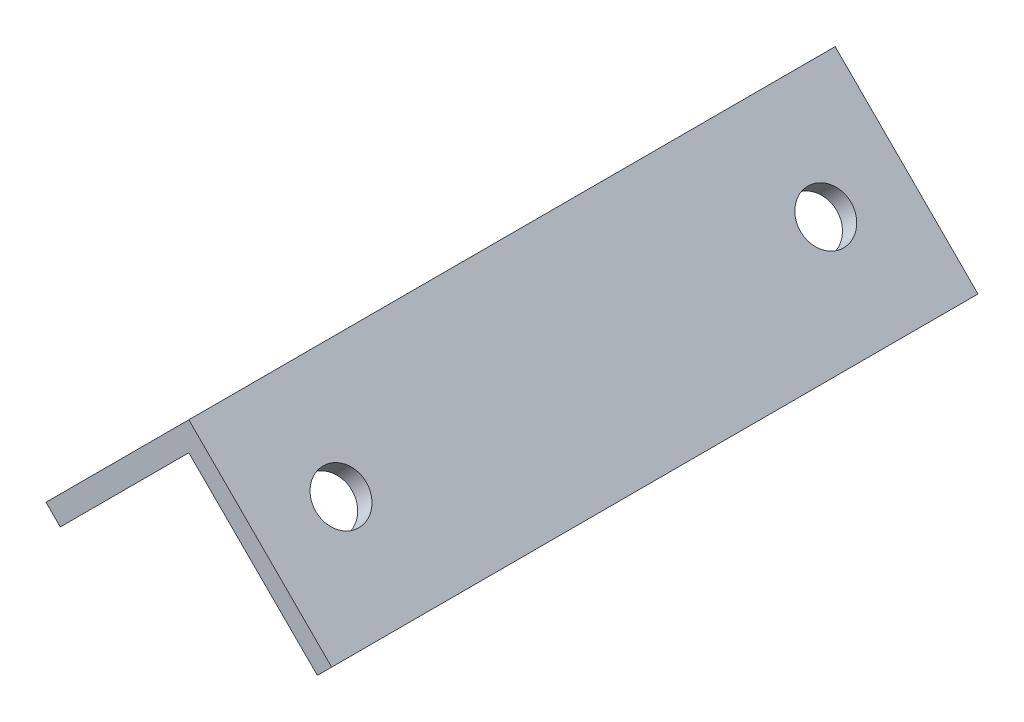
ISO-10303-21;
HEADER;
FILE_DESCRIPTION(('STEP AP214'),'2;1');
FILE_NAME('part.step','',(''),(''),'','','');
FILE_SCHEMA(('AUTOMOTIVE_DESIGN { 1 0 10303 214 1 1 1 1 }'));
ENDSEC;
DATA;
#1=APPLICATION_CONTEXT('core data for automotive mechanical design processes');
#2=APPLICATION_PROTOCOL_DEFINITION('international standard','automotive_design',2000,#1);
#3=PRODUCT_CONTEXT('',#1,'mechanical');
#4=PRODUCT('Part','Part','',(#3));
#5=PRODUCT_RELATED_PRODUCT_CATEGORY('part','',(#4));
#6=PRODUCT_DEFINITION_FORMATION('','',#4);
#7=PRODUCT_DEFINITION_CONTEXT('part definition',#1,'design');
#8=PRODUCT_DEFINITION('design','',#6,#7);
#9=PRODUCT_DEFINITION_SHAPE('','',#8);
#10=(LENGTH_UNIT() NAMED_UNIT(*) SI_UNIT(.MILLI.,.METRE.));
#11=(NAMED_UNIT(*) PLANE_ANGLE_UNIT() SI_UNIT($,.RADIAN.));
#12=(NAMED_UNIT(*) SI_UNIT($,.STERADIAN.) SOLID_ANGLE_UNIT());
#13=UNCERTAINTY_MEASURE_WITH_UNIT(LENGTH_MEASURE(1.E-05),#10,'distance_accuracy_value','');
#14=(GEOMETRIC_REPRESENTATION_CONTEXT(3) GLOBAL_UNCERTAINTY_ASSIGNED_CONTEXT((#13)) GLOBAL_UNIT_ASSIGNED_CONTEXT((#10,
#11,#12)) REPRESENTATION_CONTEXT('',''));
#15=CARTESIAN_POINT('',(0.,0.,0.));
#16=DIRECTION('',(0.,0.,1.));
#17=DIRECTION('',(1.,0.,0.));
#18=AXIS2_PLACEMENT_3D('',#15,#16,#17);
#19=CARTESIAN_POINT('',(42.6562165750785,-2.24506403026729,101.6));
#20=DIRECTION('',(0.707106781186548,0.707106781186547,0.));
#21=DIRECTION('',(-0.707106781186547,0.707106781186548,0.));
#22=AXIS2_PLACEMENT_3D('',#19,#20,#21);
#23=PLANE('',#22);
#24=DIRECTION('',(0.707106781186547,-0.707106781186548,0.));
#25=VECTOR('',#24,1.);
#26=CARTESIAN_POINT('',(42.6562165750785,-2.24506403026729,0.));
#27=LINE('',#26,#25);
#28=CARTESIAN_POINT('',(22.4506403026729,17.9605122421383,0.));
#29=VERTEX_POINT('',#28);
#30=CARTESIAN_POINT('',(42.6562165750785,-2.24506403026729,0.));
#31=VERTEX_POINT('',#30);
#32=EDGE_CURVE('E129',#29,#31,#27,.T.);
#33=ORIENTED_EDGE('',*,*,#32,.T.);
#34=DIRECTION('',(0.,0.,-1.));
#35=VECTOR('',#34,1.);
#36=CARTESIAN_POINT('',(42.6562165750785,-2.24506403026729,101.6));
#37=LINE('',#36,#35);
#38=CARTESIAN_POINT('',(42.6562165750785,-2.24506403026729,101.6));
#39=VERTEX_POINT('',#38);
#40=EDGE_CURVE('E113',#39,#31,#37,.T.);
#41=ORIENTED_EDGE('',*,*,#40,.F.);
#42=DIRECTION('',(0.707106781186547,-0.707106781186548,0.));
#43=VECTOR('',#42,1.);
#44=CARTESIAN_POINT('',(42.6562165750785,-2.24506403026729,101.6));
#45=LINE('',#44,#43);
#46=CARTESIAN_POINT('',(22.4506403026729,17.9605122421383,101.6));
#47=VERTEX_POINT('',#46);
#48=EDGE_CURVE('E104',#47,#39,#45,.T.);
#49=ORIENTED_EDGE('',*,*,#48,.F.);
#50=DIRECTION('',(0.,0.,-1.));
#51=VECTOR('',#50,1.);
#52=CARTESIAN_POINT('',(22.4506403026729,17.9605122421383,101.6));
#53=LINE('',#52,#51);
#54=EDGE_CURVE('E46',#47,#29,#53,.T.);
#55=ORIENTED_EDGE('',*,*,#54,.T.);
#56=EDGE_LOOP('',(#33,#41,#49,#55));
#57=FACE_BOUND('',#56,.T.);
#58=CARTESIAN_POINT('',(31.430896423742,8.98025612106917,12.7));
#59=DIRECTION('',(0.707106781186548,0.707106781186547,0.));
#60=DIRECTION('',(-0.707106781186547,0.707106781186548,0.));
#61=AXIS2_PLACEMENT_3D('',#58,#59,#60);
#62=CIRCLE('',#61,3.9751);
#63=CARTESIAN_POINT('',(28.6200762578474,11.7910762869638,12.7));
#64=VERTEX_POINT('',#63);
#65=EDGE_CURVE('E190',#64,#64,#62,.T.);
#66=ORIENTED_EDGE('',*,*,#65,.T.);
#67=EDGE_LOOP('',(#66));
#68=FACE_BOUND('',#67,.T.);
#69=CARTESIAN_POINT('',(31.430896423742,8.98025612106917,88.9));
#70=DIRECTION('',(0.707106781186548,0.707106781186547,0.));
#71=DIRECTION('',(-0.707106781186547,0.707106781186548,0.));
#72=AXIS2_PLACEMENT_3D('',#69,#70,#71);
#73=CIRCLE('',#72,3.9751);
#74=CARTESIAN_POINT('',(28.6200762578474,11.7910762869638,88.9));
#75=VERTEX_POINT('',#74);
#76=EDGE_CURVE('E196',#75,#75,#73,.F.);
#77=ORIENTED_EDGE('',*,*,#76,.F.);
#78=EDGE_LOOP('',(#77));
#79=FACE_BOUND('',#78,.T.);
#80=ADVANCED_FACE('F37',(#57,#68,#79),#23,.F.);
#81=CARTESIAN_POINT('',(22.4506403026729,22.4506403026729,101.6));
#82=DIRECTION('',(-0.707106781186548,-0.707106781186548,0.));
#83=DIRECTION('',(0.707106781186548,-0.707106781186547,0.));
#84=AXIS2_PLACEMENT_3D('',#81,#82,#83);
#85=PLANE('',#84);
#86=DIRECTION('',(-0.707106781186547,0.707106781186547,0.));
#87=VECTOR('',#86,1.);
#88=CARTESIAN_POINT('',(22.4506403026729,22.4506403026729,0.));
#89=LINE('',#88,#87);
#90=CARTESIAN_POINT('',(44.9012806053458,0.,0.));
#91=VERTEX_POINT('',#90);
#92=CARTESIAN_POINT('',(22.4506403026729,22.4506403026729,0.));
#93=VERTEX_POINT('',#92);
#94=EDGE_CURVE('E77',#91,#93,#89,.T.);
#95=ORIENTED_EDGE('',*,*,#94,.T.);
#96=DIRECTION('',(0.,0.,-1.));
#97=VECTOR('',#96,1.);
#98=CARTESIAN_POINT('',(22.4506403026729,22.4506403026729,101.6));
#99=LINE('',#98,#97);
#100=CARTESIAN_POINT('',(22.4506403026729,22.4506403026729,101.6));
#101=VERTEX_POINT('',#100);
#102=EDGE_CURVE('E114',#101,#93,#99,.T.);
#103=ORIENTED_EDGE('',*,*,#102,.F.);
#104=DIRECTION('',(-0.707106781186547,0.707106781186547,0.));
#105=VECTOR('',#104,1.);
#106=CARTESIAN_POINT('',(22.4506403026729,22.4506403026729,101.6));
#107=LINE('',#106,#105);
#108=CARTESIAN_POINT('',(44.9012806053458,0.,101.6));
#109=VERTEX_POINT('',#108);
#110=EDGE_CURVE('E102',#109,#101,#107,.T.);
#111=ORIENTED_EDGE('',*,*,#110,.F.);
#112=DIRECTION('',(0.,0.,-1.));
#113=VECTOR('',#112,1.);
#114=CARTESIAN_POINT('',(44.9012806053458,0.,101.6));
#115=LINE('',#114,#113);
#116=EDGE_CURVE('E109',#109,#91,#115,.T.);
#117=ORIENTED_EDGE('',*,*,#116,.T.);
#118=EDGE_LOOP('',(#95,#103,#111,#117));
#119=FACE_BOUND('',#118,.T.);
#120=CARTESIAN_POINT('',(33.6759604540093,11.2253201513365,12.7));
#121=DIRECTION('',(0.707106781186547,0.707106781186548,0.));
#122=DIRECTION('',(-0.707106781186548,0.707106781186547,0.));
#123=AXIS2_PLACEMENT_3D('',#120,#121,#122);
#124=CIRCLE('',#123,3.9751);
#125=CARTESIAN_POINT('',(30.8651402881147,14.0361403172311,12.7));
#126=VERTEX_POINT('',#125);
#127=EDGE_CURVE('E193',#126,#126,#124,.T.);
#128=ORIENTED_EDGE('',*,*,#127,.F.);
#129=EDGE_LOOP('',(#128));
#130=FACE_BOUND('',#129,.T.);
#131=CARTESIAN_POINT('',(33.6759604540093,11.2253201513365,88.9));
#132=DIRECTION('',(-0.707106781186547,-0.707106781186548,0.));
#133=DIRECTION('',(-0.707106781186548,0.707106781186547,0.));
#134=AXIS2_PLACEMENT_3D('',#131,#132,#133);
#135=CIRCLE('',#134,3.9751);
#136=CARTESIAN_POINT('',(30.8651402881147,14.0361403172311,88.9));
#137=VERTEX_POINT('',#136);
#138=EDGE_CURVE('E199',#137,#137,#135,.T.);
#139=ORIENTED_EDGE('',*,*,#138,.T.);
#140=EDGE_LOOP('',(#139));
#141=FACE_BOUND('',#140,.T.);
#142=ADVANCED_FACE('F116',(#119,#130,#141),#85,.F.);
#143=CARTESIAN_POINT('',(2.24506403026729,-2.24506403026729,101.6));
#144=DIRECTION('',(0.707106781186547,0.707106781186548,0.));
#145=DIRECTION('',(-0.707106781186548,0.707106781186547,0.));
#146=AXIS2_PLACEMENT_3D('',#143,#144,#145);
#147=PLANE('',#146);
#148=DIRECTION('',(0.707106781186548,-0.707106781186547,0.));
#149=VECTOR('',#148,1.);
#150=CARTESIAN_POINT('',(2.24506403026729,-2.24506403026729,0.));
#151=LINE('',#150,#149);
#152=CARTESIAN_POINT('',(0.,0.,0.));
#153=VERTEX_POINT('',#152);
#154=CARTESIAN_POINT('',(2.24506403026729,-2.24506403026729,0.));
#155=VERTEX_POINT('',#154);
#156=EDGE_CURVE('E123',#153,#155,#151,.T.);
#157=ORIENTED_EDGE('',*,*,#156,.T.);
#158=DIRECTION('',(0.,0.,-1.));
#159=VECTOR('',#158,1.);
#160=CARTESIAN_POINT('',(2.24506403026729,-2.24506403026729,101.6));
#161=LINE('',#160,#159);
#162=CARTESIAN_POINT('',(2.24506403026729,-2.24506403026729,101.6));
#163=VERTEX_POINT('',#162);
#164=EDGE_CURVE('E11',#163,#155,#161,.T.);
#165=ORIENTED_EDGE('',*,*,#164,.F.);
#166=DIRECTION('',(0.707106781186548,-0.707106781186547,0.));
#167=VECTOR('',#166,1.);
#168=CARTESIAN_POINT('',(2.24506403026729,-2.24506403026729,101.6));
#169=LINE('',#168,#167);
#170=CARTESIAN_POINT('',(0.,0.,101.6));
#171=VERTEX_POINT('',#170);
#172=EDGE_CURVE('E134',#171,#163,#169,.T.);
#173=ORIENTED_EDGE('',*,*,#172,.F.);
#174=DIRECTION('',(0.,0.,-1.));
#175=VECTOR('',#174,1.);
#176=CARTESIAN_POINT('',(0.,0.,101.6));
#177=LINE('',#176,#175);
#178=EDGE_CURVE('E119',#171,#153,#177,.T.);
#179=ORIENTED_EDGE('',*,*,#178,.T.);
#180=EDGE_LOOP('',(#157,#165,#173,#179));
#181=FACE_BOUND('',#180,.T.);
#182=ADVANCED_FACE('F39',(#181),#147,.F.);
#183=CARTESIAN_POINT('',(22.4506403026729,17.9605122421383,101.6));
#184=DIRECTION('',(-0.707106781186548,0.707106781186548,0.));
#185=DIRECTION('',(-0.707106781186548,-0.707106781186547,0.));
#186=AXIS2_PLACEMENT_3D('',#183,#184,#185);
#187=PLANE('',#186);
#188=CARTESIAN_POINT('',(13.4703841816037,8.98025612106914,69.85));
#189=DIRECTION('',(-0.707106781186548,0.707106781186548,0.));
#190=DIRECTION('',(-0.707106781186548,-0.707106781186547,0.));
#191=AXIS2_PLACEMENT_3D('',#188,#189,#190);
#192=CIRCLE('',#191,3.97510000000001);
#193=CARTESIAN_POINT('',(10.6595640157091,6.1694359551745,69.85));
#194=VERTEX_POINT('',#193);
#195=EDGE_CURVE('E175',#194,#194,#192,.T.);
#196=ORIENTED_EDGE('',*,*,#195,.T.);
#197=EDGE_LOOP('',(#196));
#198=FACE_BOUND('',#197,.T.);
#199=CARTESIAN_POINT('',(13.4703841816037,8.98025612106915,31.75));
#200=DIRECTION('',(-0.707106781186548,0.707106781186548,0.));
#201=DIRECTION('',(-0.707106781186548,-0.707106781186547,0.));
#202=AXIS2_PLACEMENT_3D('',#199,#200,#201);
#203=CIRCLE('',#202,3.9751);
#204=CARTESIAN_POINT('',(10.6595640157091,6.1694359551745,31.75));
#205=VERTEX_POINT('',#204);
#206=EDGE_CURVE('E127',#205,#205,#203,.T.);
#207=ORIENTED_EDGE('',*,*,#206,.T.);
#208=EDGE_LOOP('',(#207));
#209=FACE_BOUND('',#208,.T.);
#210=DIRECTION('',(0.707106781186547,0.707106781186547,0.));
#211=VECTOR('',#210,1.);
#212=CARTESIAN_POINT('',(22.4506403026729,17.9605122421383,0.));
#213=LINE('',#212,#211);
#214=EDGE_CURVE('E126',#155,#29,#213,.T.);
#215=ORIENTED_EDGE('',*,*,#214,.T.);
#216=ORIENTED_EDGE('',*,*,#54,.F.);
#217=DIRECTION('',(0.707106781186547,0.707106781186547,0.));
#218=VECTOR('',#217,1.);
#219=CARTESIAN_POINT('',(22.4506403026729,17.9605122421383,101.6));
#220=LINE('',#219,#218);
#221=EDGE_CURVE('E91',#163,#47,#220,.T.);
#222=ORIENTED_EDGE('',*,*,#221,.F.);
#223=ORIENTED_EDGE('',*,*,#164,.T.);
#224=EDGE_LOOP('',(#215,#216,#222,#223));
#225=FACE_BOUND('',#224,.T.);
#226=ADVANCED_FACE('F156',(#198,#209,#225),#187,.F.);
#227=CARTESIAN_POINT('',(44.9012806053458,0.,101.6));
#228=DIRECTION('',(-0.707106781186547,0.707106781186548,0.));
#229=DIRECTION('',(-0.707106781186548,-0.707106781186547,0.));
#230=AXIS2_PLACEMENT_3D('',#227,#228,#229);
#231=PLANE('',#230);
#232=DIRECTION('',(0.707106781186548,0.707106781186547,0.));
#233=VECTOR('',#232,1.);
#234=CARTESIAN_POINT('',(44.9012806053458,0.,0.));
#235=LINE('',#234,#233);
#236=EDGE_CURVE('E112',#31,#91,#235,.T.);
#237=ORIENTED_EDGE('',*,*,#236,.T.);
#238=ORIENTED_EDGE('',*,*,#116,.F.);
#239=DIRECTION('',(0.707106781186548,0.707106781186547,0.));
#240=VECTOR('',#239,1.);
#241=CARTESIAN_POINT('',(44.9012806053458,0.,101.6));
#242=LINE('',#241,#240);
#243=EDGE_CURVE('E98',#39,#109,#242,.T.);
#244=ORIENTED_EDGE('',*,*,#243,.F.);
#245=ORIENTED_EDGE('',*,*,#40,.T.);
#246=EDGE_LOOP('',(#237,#238,#244,#245));
#247=FACE_BOUND('',#246,.T.);
#248=ADVANCED_FACE('F110',(#247),#231,.F.);
#249=CARTESIAN_POINT('',(0.,0.,101.6));
#250=DIRECTION('',(0.707106781186548,-0.707106781186547,0.));
#251=DIRECTION('',(0.707106781186547,0.707106781186548,0.));
#252=AXIS2_PLACEMENT_3D('',#249,#250,#251);
#253=PLANE('',#252);
#254=CARTESIAN_POINT('',(11.2253201513364,11.2253201513364,69.85));
#255=DIRECTION('',(-0.707106781186548,0.707106781186547,0.));
#256=DIRECTION('',(-0.707106781186547,-0.707106781186548,0.));
#257=AXIS2_PLACEMENT_3D('',#254,#255,#256);
#258=CIRCLE('',#257,3.97510000000001);
#259=CARTESIAN_POINT('',(8.41449998544179,8.41449998544179,69.85));
#260=VERTEX_POINT('',#259);
#261=EDGE_CURVE('E187',#260,#260,#258,.T.);
#262=ORIENTED_EDGE('',*,*,#261,.F.);
#263=EDGE_LOOP('',(#262));
#264=FACE_BOUND('',#263,.T.);
#265=CARTESIAN_POINT('',(11.2253201513364,11.2253201513364,31.75));
#266=DIRECTION('',(-0.707106781186548,0.707106781186547,0.));
#267=DIRECTION('',(-0.707106781186547,-0.707106781186548,0.));
#268=AXIS2_PLACEMENT_3D('',#265,#266,#267);
#269=CIRCLE('',#268,3.9751);
#270=CARTESIAN_POINT('',(8.4144999854418,8.4144999854418,31.75));
#271=VERTEX_POINT('',#270);
#272=EDGE_CURVE('E179',#271,#271,#269,.T.);
#273=ORIENTED_EDGE('',*,*,#272,.F.);
#274=EDGE_LOOP('',(#273));
#275=FACE_BOUND('',#274,.T.);
#276=DIRECTION('',(-0.707106781186547,-0.707106781186548,0.));
#277=VECTOR('',#276,1.);
#278=CARTESIAN_POINT('',(0.,0.,0.));
#279=LINE('',#278,#277);
#280=EDGE_CURVE('E83',#93,#153,#279,.T.);
#281=ORIENTED_EDGE('',*,*,#280,.T.);
#282=ORIENTED_EDGE('',*,*,#178,.F.);
#283=DIRECTION('',(-0.707106781186547,-0.707106781186548,0.));
#284=VECTOR('',#283,1.);
#285=CARTESIAN_POINT('',(0.,0.,101.6));
#286=LINE('',#285,#284);
#287=EDGE_CURVE('E54',#101,#171,#286,.T.);
#288=ORIENTED_EDGE('',*,*,#287,.F.);
#289=ORIENTED_EDGE('',*,*,#102,.T.);
#290=EDGE_LOOP('',(#281,#282,#288,#289));
#291=FACE_BOUND('',#290,.T.);
#292=ADVANCED_FACE('F147',(#264,#275,#291),#253,.F.);
#293=CARTESIAN_POINT('',(0.,0.,101.6));
#294=DIRECTION('',(0.,0.,-1.));
#295=DIRECTION('',(-1.,0.,0.));
#296=AXIS2_PLACEMENT_3D('',#293,#294,#295);
#297=PLANE('',#296);
#298=ORIENTED_EDGE('',*,*,#172,.T.);
#299=ORIENTED_EDGE('',*,*,#221,.T.);
#300=ORIENTED_EDGE('',*,*,#48,.T.);
#301=ORIENTED_EDGE('',*,*,#243,.T.);
#302=ORIENTED_EDGE('',*,*,#110,.T.);
#303=ORIENTED_EDGE('',*,*,#287,.T.);
#304=EDGE_LOOP('',(#298,#299,#300,#301,#302,#303));
#305=FACE_BOUND('',#304,.T.);
#306=ADVANCED_FACE('F100',(#305),#297,.F.);
#307=CARTESIAN_POINT('',(0.,0.,0.));
#308=DIRECTION('',(0.,0.,-1.));
#309=DIRECTION('',(-1.,0.,0.));
#310=AXIS2_PLACEMENT_3D('',#307,#308,#309);
#311=PLANE('',#310);
#312=ORIENTED_EDGE('',*,*,#156,.F.);
#313=ORIENTED_EDGE('',*,*,#280,.F.);
#314=ORIENTED_EDGE('',*,*,#94,.F.);
#315=ORIENTED_EDGE('',*,*,#236,.F.);
#316=ORIENTED_EDGE('',*,*,#32,.F.);
#317=ORIENTED_EDGE('',*,*,#214,.F.);
#318=EDGE_LOOP('',(#312,#313,#314,#315,#316,#317));
#319=FACE_BOUND('',#318,.T.);
#320=ADVANCED_FACE('F143',(#319),#311,.T.);
#321=CARTESIAN_POINT('',(34.798492469143,-12.3478521664701,31.75));
#322=DIRECTION('',(-0.707106781186548,0.707106781186547,0.));
#323=DIRECTION('',(-0.707106781186547,-0.707106781186548,0.));
#324=AXIS2_PLACEMENT_3D('',#321,#322,#323);
#325=CYLINDRICAL_SURFACE('',#324,3.9751);
#326=ORIENTED_EDGE('',*,*,#272,.T.);
#327=EDGE_LOOP('',(#326));
#328=FACE_BOUND('',#327,.T.);
#329=ORIENTED_EDGE('',*,*,#206,.F.);
#330=EDGE_LOOP('',(#329));
#331=FACE_BOUND('',#330,.T.);
#332=ADVANCED_FACE('F220',(#328,#331),#325,.F.);
#333=CARTESIAN_POINT('',(34.798492469143,-12.3478521664701,69.85));
#334=DIRECTION('',(-0.707106781186548,0.707106781186547,0.));
#335=DIRECTION('',(-0.707106781186547,-0.707106781186548,0.));
#336=AXIS2_PLACEMENT_3D('',#333,#334,#335);
#337=CYLINDRICAL_SURFACE('',#336,3.97510000000001);
#338=ORIENTED_EDGE('',*,*,#261,.T.);
#339=EDGE_LOOP('',(#338));
#340=FACE_BOUND('',#339,.T.);
#341=ORIENTED_EDGE('',*,*,#195,.F.);
#342=EDGE_LOOP('',(#341));
#343=FACE_BOUND('',#342,.T.);
#344=ADVANCED_FACE('F214',(#340,#343),#337,.F.);
#345=CARTESIAN_POINT('',(10.1027881362028,-12.3478521664701,12.7));
#346=DIRECTION('',(0.707106781186547,0.707106781186548,0.));
#347=DIRECTION('',(-0.707106781186548,0.707106781186547,0.));
#348=AXIS2_PLACEMENT_3D('',#345,#346,#347);
#349=CYLINDRICAL_SURFACE('',#348,3.9751);
#350=ORIENTED_EDGE('',*,*,#127,.T.);
#351=EDGE_LOOP('',(#350));
#352=FACE_BOUND('',#351,.T.);
#353=ORIENTED_EDGE('',*,*,#65,.F.);
#354=EDGE_LOOP('',(#353));
#355=FACE_BOUND('',#354,.T.);
#356=ADVANCED_FACE('F207',(#352,#355),#349,.F.);
#357=CARTESIAN_POINT('',(10.1027881362028,-12.3478521664701,88.9));
#358=DIRECTION('',(0.707106781186547,0.707106781186548,0.));
#359=DIRECTION('',(-0.707106781186548,0.707106781186547,0.));
#360=AXIS2_PLACEMENT_3D('',#357,#358,#359);
#361=CYLINDRICAL_SURFACE('',#360,3.9751);
#362=ORIENTED_EDGE('',*,*,#138,.F.);
#363=EDGE_LOOP('',(#362));
#364=FACE_BOUND('',#363,.T.);
#365=ORIENTED_EDGE('',*,*,#76,.T.);
#366=EDGE_LOOP('',(#365));
#367=FACE_BOUND('',#366,.T.);
#368=ADVANCED_FACE('F204',(#364,#367),#361,.F.);
#369=CLOSED_SHELL('',(#80,#142,#182,#226,#248,#292,#306,#320,#332,#344,#356,#368));
#370=MANIFOLD_SOLID_BREP('B2',#369);
#371=ADVANCED_BREP_SHAPE_REPRESENTATION('',(#18,#370),#14);
#372=SHAPE_DEFINITION_REPRESENTATION(#9,#371);
ENDSEC;
END-ISO-10303-21;
